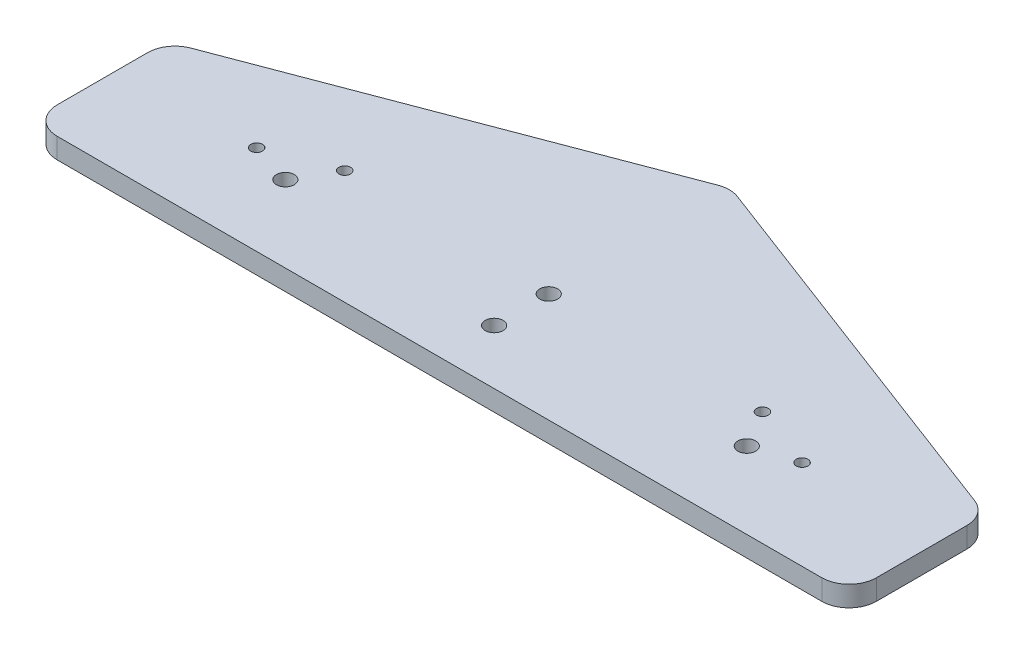
ISO-10303-21;
HEADER;
FILE_DESCRIPTION(('STEP AP214'),'2;1');
FILE_NAME('part.step','',(''),(''),'','','');
FILE_SCHEMA(('AUTOMOTIVE_DESIGN { 1 0 10303 214 1 1 1 1 }'));
ENDSEC;
DATA;
#1=APPLICATION_CONTEXT('core data for automotive mechanical design processes');
#2=APPLICATION_PROTOCOL_DEFINITION('international standard','automotive_design',2000,#1);
#3=PRODUCT_CONTEXT('',#1,'mechanical');
#4=PRODUCT('Part','Part','',(#3));
#5=PRODUCT_RELATED_PRODUCT_CATEGORY('part','',(#4));
#6=PRODUCT_DEFINITION_FORMATION('','',#4);
#7=PRODUCT_DEFINITION_CONTEXT('part definition',#1,'design');
#8=PRODUCT_DEFINITION('design','',#6,#7);
#9=PRODUCT_DEFINITION_SHAPE('','',#8);
#10=(LENGTH_UNIT() NAMED_UNIT(*) SI_UNIT(.MILLI.,.METRE.));
#11=(NAMED_UNIT(*) PLANE_ANGLE_UNIT() SI_UNIT($,.RADIAN.));
#12=(NAMED_UNIT(*) SI_UNIT($,.STERADIAN.) SOLID_ANGLE_UNIT());
#13=UNCERTAINTY_MEASURE_WITH_UNIT(LENGTH_MEASURE(1.E-05),#10,'distance_accuracy_value','');
#14=(GEOMETRIC_REPRESENTATION_CONTEXT(3) GLOBAL_UNCERTAINTY_ASSIGNED_CONTEXT((#13)) GLOBAL_UNIT_ASSIGNED_CONTEXT((#10,
#11,#12)) REPRESENTATION_CONTEXT('',''));
#15=CARTESIAN_POINT('',(0.,0.,0.));
#16=DIRECTION('',(0.,0.,1.));
#17=DIRECTION('',(1.,0.,0.));
#18=AXIS2_PLACEMENT_3D('',#15,#16,#17);
#19=CARTESIAN_POINT('',(0.,-7.5,-96.1362755383189));
#20=DIRECTION('',(0.,1.,0.));
#21=DIRECTION('',(0.,0.,1.));
#22=AXIS2_PLACEMENT_3D('',#19,#20,#21);
#23=CYLINDRICAL_SURFACE('',#22,9.99999999999999);
#24=CARTESIAN_POINT('',(0.,0.,-96.1362755383189));
#25=DIRECTION('',(0.,1.,0.));
#26=DIRECTION('',(0.,0.,1.));
#27=AXIS2_PLACEMENT_3D('',#24,#25,#26);
#28=CIRCLE('',#27,9.99999999999999);
#29=CARTESIAN_POINT('',(3.54291037997725,0.,-105.487627635179));
#30=VERTEX_POINT('',#29);
#31=CARTESIAN_POINT('',(-3.54291037997707,0.,-105.487627635179));
#32=VERTEX_POINT('',#31);
#33=EDGE_CURVE('E166',#30,#32,#28,.T.);
#34=ORIENTED_EDGE('',*,*,#33,.F.);
#35=DIRECTION('',(0.,1.,0.));
#36=VECTOR('',#35,1.);
#37=CARTESIAN_POINT('',(3.54291037997725,-7.5,-105.487627635179));
#38=LINE('',#37,#36);
#39=CARTESIAN_POINT('',(3.54291037997725,-7.5,-105.487627635179));
#40=VERTEX_POINT('',#39);
#41=EDGE_CURVE('E13',#40,#30,#38,.T.);
#42=ORIENTED_EDGE('',*,*,#41,.F.);
#43=CARTESIAN_POINT('',(0.,-7.5,-96.1362755383189));
#44=DIRECTION('',(0.,1.,0.));
#45=DIRECTION('',(0.,0.,1.));
#46=AXIS2_PLACEMENT_3D('',#43,#44,#45);
#47=CIRCLE('',#46,9.99999999999999);
#48=CARTESIAN_POINT('',(-3.54291037997707,-7.5,-105.487627635179));
#49=VERTEX_POINT('',#48);
#50=EDGE_CURVE('E203',#40,#49,#47,.T.);
#51=ORIENTED_EDGE('',*,*,#50,.T.);
#52=DIRECTION('',(0.,1.,0.));
#53=VECTOR('',#52,1.);
#54=CARTESIAN_POINT('',(-3.54291037997707,-7.5,-105.487627635179));
#55=LINE('',#54,#53);
#56=EDGE_CURVE('E54',#49,#32,#55,.T.);
#57=ORIENTED_EDGE('',*,*,#56,.T.);
#58=EDGE_LOOP('',(#34,#42,#51,#57));
#59=FACE_BOUND('',#58,.T.);
#60=ADVANCED_FACE('F51',(#59),#23,.T.);
#61=CARTESIAN_POINT('',(143.542910379977,-7.5,-52.446372417835));
#62=DIRECTION('',(0.354291037997716,0.,-0.935135209686011));
#63=DIRECTION('',(-0.935135209686012,0.,-0.354291037997717));
#64=AXIS2_PLACEMENT_3D('',#61,#62,#63);
#65=PLANE('',#64);
#66=DIRECTION('',(-0.935135209686011,0.,-0.354291037997717));
#67=VECTOR('',#66,1.);
#68=CARTESIAN_POINT('',(143.542910379977,0.,-52.446372417835));
#69=LINE('',#68,#67);
#70=CARTESIAN_POINT('',(143.542910379977,0.,-52.446372417835));
#71=VERTEX_POINT('',#70);
#72=EDGE_CURVE('E200',#71,#30,#69,.T.);
#73=ORIENTED_EDGE('',*,*,#72,.F.);
#74=DIRECTION('',(0.,1.,0.));
#75=VECTOR('',#74,1.);
#76=CARTESIAN_POINT('',(143.542910379977,-7.5,-52.446372417835));
#77=LINE('',#76,#75);
#78=CARTESIAN_POINT('',(143.542910379977,-7.5,-52.446372417835));
#79=VERTEX_POINT('',#78);
#80=EDGE_CURVE('E61',#79,#71,#77,.T.);
#81=ORIENTED_EDGE('',*,*,#80,.F.);
#82=DIRECTION('',(-0.935135209686011,0.,-0.354291037997717));
#83=VECTOR('',#82,1.);
#84=CARTESIAN_POINT('',(143.542910379977,-7.5,-52.446372417835));
#85=LINE('',#84,#83);
#86=EDGE_CURVE('E152',#79,#40,#85,.T.);
#87=ORIENTED_EDGE('',*,*,#86,.T.);
#88=ORIENTED_EDGE('',*,*,#41,.T.);
#89=EDGE_LOOP('',(#73,#81,#87,#88));
#90=FACE_BOUND('',#89,.T.);
#91=ADVANCED_FACE('F228',(#90),#65,.T.);
#92=CARTESIAN_POINT('',(140.,-7.5,-43.0950203209749));
#93=DIRECTION('',(0.,1.,0.));
#94=DIRECTION('',(0.,0.,1.));
#95=AXIS2_PLACEMENT_3D('',#92,#93,#94);
#96=CYLINDRICAL_SURFACE('',#95,10.);
#97=CARTESIAN_POINT('',(140.,0.,-43.0950203209749));
#98=DIRECTION('',(0.,1.,0.));
#99=DIRECTION('',(0.,0.,1.));
#100=AXIS2_PLACEMENT_3D('',#97,#98,#99);
#101=CIRCLE('',#100,10.);
#102=CARTESIAN_POINT('',(150.,0.,-43.0950203209749));
#103=VERTEX_POINT('',#102);
#104=EDGE_CURVE('E138',#103,#71,#101,.T.);
#105=ORIENTED_EDGE('',*,*,#104,.F.);
#106=DIRECTION('',(0.,1.,0.));
#107=VECTOR('',#106,1.);
#108=CARTESIAN_POINT('',(150.,-7.5,-43.0950203209749));
#109=LINE('',#108,#107);
#110=CARTESIAN_POINT('',(150.,-7.5,-43.0950203209749));
#111=VERTEX_POINT('',#110);
#112=EDGE_CURVE('E133',#111,#103,#109,.T.);
#113=ORIENTED_EDGE('',*,*,#112,.F.);
#114=CARTESIAN_POINT('',(140.,-7.5,-43.0950203209749));
#115=DIRECTION('',(0.,1.,0.));
#116=DIRECTION('',(0.,0.,1.));
#117=AXIS2_PLACEMENT_3D('',#114,#115,#116);
#118=CIRCLE('',#117,10.);
#119=EDGE_CURVE('E136',#111,#79,#118,.T.);
#120=ORIENTED_EDGE('',*,*,#119,.T.);
#121=ORIENTED_EDGE('',*,*,#80,.T.);
#122=EDGE_LOOP('',(#105,#113,#120,#121));
#123=FACE_BOUND('',#122,.T.);
#124=ADVANCED_FACE('F135',(#123),#96,.T.);
#125=CARTESIAN_POINT('',(150.,-7.5,-10.));
#126=DIRECTION('',(1.,0.,0.));
#127=DIRECTION('',(0.,0.,-1.));
#128=AXIS2_PLACEMENT_3D('',#125,#126,#127);
#129=PLANE('',#128);
#130=DIRECTION('',(0.,0.,-1.));
#131=VECTOR('',#130,1.);
#132=CARTESIAN_POINT('',(150.,0.,-10.));
#133=LINE('',#132,#131);
#134=CARTESIAN_POINT('',(150.,0.,-10.));
#135=VERTEX_POINT('',#134);
#136=EDGE_CURVE('E195',#135,#103,#133,.T.);
#137=ORIENTED_EDGE('',*,*,#136,.F.);
#138=DIRECTION('',(0.,1.,0.));
#139=VECTOR('',#138,1.);
#140=CARTESIAN_POINT('',(150.,-7.5,-10.));
#141=LINE('',#140,#139);
#142=CARTESIAN_POINT('',(150.,-7.5,-10.));
#143=VERTEX_POINT('',#142);
#144=EDGE_CURVE('E144',#143,#135,#141,.T.);
#145=ORIENTED_EDGE('',*,*,#144,.F.);
#146=DIRECTION('',(0.,0.,-1.));
#147=VECTOR('',#146,1.);
#148=CARTESIAN_POINT('',(150.,-7.5,-10.));
#149=LINE('',#148,#147);
#150=EDGE_CURVE('E150',#143,#111,#149,.T.);
#151=ORIENTED_EDGE('',*,*,#150,.T.);
#152=ORIENTED_EDGE('',*,*,#112,.T.);
#153=EDGE_LOOP('',(#137,#145,#151,#152));
#154=FACE_BOUND('',#153,.T.);
#155=ADVANCED_FACE('F155',(#154),#129,.T.);
#156=CARTESIAN_POINT('',(140.,-7.5,-10.));
#157=DIRECTION('',(0.,1.,0.));
#158=DIRECTION('',(0.,0.,1.));
#159=AXIS2_PLACEMENT_3D('',#156,#157,#158);
#160=CYLINDRICAL_SURFACE('',#159,10.);
#161=CARTESIAN_POINT('',(140.,0.,-10.));
#162=DIRECTION('',(0.,1.,0.));
#163=DIRECTION('',(0.,0.,1.));
#164=AXIS2_PLACEMENT_3D('',#161,#162,#163);
#165=CIRCLE('',#164,10.);
#166=CARTESIAN_POINT('',(140.,0.,0.));
#167=VERTEX_POINT('',#166);
#168=EDGE_CURVE('E191',#167,#135,#165,.T.);
#169=ORIENTED_EDGE('',*,*,#168,.F.);
#170=DIRECTION('',(0.,1.,0.));
#171=VECTOR('',#170,1.);
#172=CARTESIAN_POINT('',(140.,-7.5,0.));
#173=LINE('',#172,#171);
#174=CARTESIAN_POINT('',(140.,-7.5,0.));
#175=VERTEX_POINT('',#174);
#176=EDGE_CURVE('E209',#175,#167,#173,.T.);
#177=ORIENTED_EDGE('',*,*,#176,.F.);
#178=CARTESIAN_POINT('',(140.,-7.5,-10.));
#179=DIRECTION('',(0.,1.,0.));
#180=DIRECTION('',(0.,0.,1.));
#181=AXIS2_PLACEMENT_3D('',#178,#179,#180);
#182=CIRCLE('',#181,10.);
#183=EDGE_CURVE('E157',#175,#143,#182,.T.);
#184=ORIENTED_EDGE('',*,*,#183,.T.);
#185=ORIENTED_EDGE('',*,*,#144,.T.);
#186=EDGE_LOOP('',(#169,#177,#184,#185));
#187=FACE_BOUND('',#186,.T.);
#188=ADVANCED_FACE('F241',(#187),#160,.T.);
#189=CARTESIAN_POINT('',(0.,-7.5,0.));
#190=DIRECTION('',(0.,0.,1.));
#191=DIRECTION('',(1.,0.,0.));
#192=AXIS2_PLACEMENT_3D('',#189,#190,#191);
#193=PLANE('',#192);
#194=DIRECTION('',(1.,0.,0.));
#195=VECTOR('',#194,1.);
#196=CARTESIAN_POINT('',(0.,0.,0.));
#197=LINE('',#196,#195);
#198=CARTESIAN_POINT('',(-140.,0.,0.));
#199=VERTEX_POINT('',#198);
#200=EDGE_CURVE('E187',#199,#167,#197,.T.);
#201=ORIENTED_EDGE('',*,*,#200,.F.);
#202=DIRECTION('',(0.,1.,0.));
#203=VECTOR('',#202,1.);
#204=CARTESIAN_POINT('',(-140.,-7.5,0.));
#205=LINE('',#204,#203);
#206=CARTESIAN_POINT('',(-140.,-7.5,0.));
#207=VERTEX_POINT('',#206);
#208=EDGE_CURVE('E212',#207,#199,#205,.T.);
#209=ORIENTED_EDGE('',*,*,#208,.F.);
#210=DIRECTION('',(1.,0.,0.));
#211=VECTOR('',#210,1.);
#212=CARTESIAN_POINT('',(-140.,-7.5,0.));
#213=LINE('',#212,#211);
#214=EDGE_CURVE('E160',#207,#175,#213,.T.);
#215=ORIENTED_EDGE('',*,*,#214,.T.);
#216=ORIENTED_EDGE('',*,*,#176,.T.);
#217=EDGE_LOOP('',(#201,#209,#215,#216));
#218=FACE_BOUND('',#217,.T.);
#219=ADVANCED_FACE('F244',(#218),#193,.T.);
#220=CARTESIAN_POINT('',(-140.,-7.5,-10.));
#221=DIRECTION('',(0.,1.,0.));
#222=DIRECTION('',(0.,0.,1.));
#223=AXIS2_PLACEMENT_3D('',#220,#221,#222);
#224=CYLINDRICAL_SURFACE('',#223,10.);
#225=CARTESIAN_POINT('',(-140.,0.,-10.));
#226=DIRECTION('',(0.,1.,0.));
#227=DIRECTION('',(0.,0.,1.));
#228=AXIS2_PLACEMENT_3D('',#225,#226,#227);
#229=CIRCLE('',#228,10.);
#230=CARTESIAN_POINT('',(-150.,0.,-10.));
#231=VERTEX_POINT('',#230);
#232=EDGE_CURVE('E183',#231,#199,#229,.T.);
#233=ORIENTED_EDGE('',*,*,#232,.F.);
#234=DIRECTION('',(0.,1.,0.));
#235=VECTOR('',#234,1.);
#236=CARTESIAN_POINT('',(-150.,-7.5,-10.));
#237=LINE('',#236,#235);
#238=CARTESIAN_POINT('',(-150.,-7.5,-10.));
#239=VERTEX_POINT('',#238);
#240=EDGE_CURVE('E216',#239,#231,#237,.T.);
#241=ORIENTED_EDGE('',*,*,#240,.F.);
#242=CARTESIAN_POINT('',(-140.,-7.5,-10.));
#243=DIRECTION('',(0.,1.,0.));
#244=DIRECTION('',(0.,0.,1.));
#245=AXIS2_PLACEMENT_3D('',#242,#243,#244);
#246=CIRCLE('',#245,10.);
#247=EDGE_CURVE('E384',#239,#207,#246,.T.);
#248=ORIENTED_EDGE('',*,*,#247,.T.);
#249=ORIENTED_EDGE('',*,*,#208,.T.);
#250=EDGE_LOOP('',(#233,#241,#248,#249));
#251=FACE_BOUND('',#250,.T.);
#252=ADVANCED_FACE('F248',(#251),#224,.T.);
#253=CARTESIAN_POINT('',(-150.,-7.5,-43.0950203209749));
#254=DIRECTION('',(-1.,0.,0.));
#255=DIRECTION('',(0.,0.,1.));
#256=AXIS2_PLACEMENT_3D('',#253,#254,#255);
#257=PLANE('',#256);
#258=DIRECTION('',(0.,0.,1.));
#259=VECTOR('',#258,1.);
#260=CARTESIAN_POINT('',(-150.,0.,-43.0950203209749));
#261=LINE('',#260,#259);
#262=CARTESIAN_POINT('',(-150.,0.,-43.0950203209749));
#263=VERTEX_POINT('',#262);
#264=EDGE_CURVE('E179',#263,#231,#261,.T.);
#265=ORIENTED_EDGE('',*,*,#264,.F.);
#266=DIRECTION('',(0.,1.,0.));
#267=VECTOR('',#266,1.);
#268=CARTESIAN_POINT('',(-150.,-7.5,-43.0950203209749));
#269=LINE('',#268,#267);
#270=CARTESIAN_POINT('',(-150.,-7.5,-43.0950203209749));
#271=VERTEX_POINT('',#270);
#272=EDGE_CURVE('E219',#271,#263,#269,.T.);
#273=ORIENTED_EDGE('',*,*,#272,.F.);
#274=DIRECTION('',(0.,0.,1.));
#275=VECTOR('',#274,1.);
#276=CARTESIAN_POINT('',(-150.,-7.5,-43.0950203209749));
#277=LINE('',#276,#275);
#278=EDGE_CURVE('E380',#271,#239,#277,.T.);
#279=ORIENTED_EDGE('',*,*,#278,.T.);
#280=ORIENTED_EDGE('',*,*,#240,.T.);
#281=EDGE_LOOP('',(#265,#273,#279,#280));
#282=FACE_BOUND('',#281,.T.);
#283=ADVANCED_FACE('F252',(#282),#257,.T.);
#284=CARTESIAN_POINT('',(-140.,-7.5,-43.0950203209749));
#285=DIRECTION('',(0.,1.,0.));
#286=DIRECTION('',(0.,0.,1.));
#287=AXIS2_PLACEMENT_3D('',#284,#285,#286);
#288=CYLINDRICAL_SURFACE('',#287,9.99999999999999);
#289=CARTESIAN_POINT('',(-140.,0.,-43.0950203209749));
#290=DIRECTION('',(0.,1.,0.));
#291=DIRECTION('',(0.,0.,1.));
#292=AXIS2_PLACEMENT_3D('',#289,#290,#291);
#293=CIRCLE('',#292,9.99999999999999);
#294=CARTESIAN_POINT('',(-143.542910379977,0.,-52.446372417835));
#295=VERTEX_POINT('',#294);
#296=EDGE_CURVE('E175',#295,#263,#293,.T.);
#297=ORIENTED_EDGE('',*,*,#296,.F.);
#298=DIRECTION('',(0.,1.,0.));
#299=VECTOR('',#298,1.);
#300=CARTESIAN_POINT('',(-143.542910379977,-7.5,-52.446372417835));
#301=LINE('',#300,#299);
#302=CARTESIAN_POINT('',(-143.542910379977,-7.5,-52.446372417835));
#303=VERTEX_POINT('',#302);
#304=EDGE_CURVE('E221',#303,#295,#301,.T.);
#305=ORIENTED_EDGE('',*,*,#304,.F.);
#306=CARTESIAN_POINT('',(-140.,-7.5,-43.0950203209749));
#307=DIRECTION('',(0.,1.,0.));
#308=DIRECTION('',(0.,0.,1.));
#309=AXIS2_PLACEMENT_3D('',#306,#307,#308);
#310=CIRCLE('',#309,9.99999999999999);
#311=EDGE_CURVE('E376',#303,#271,#310,.T.);
#312=ORIENTED_EDGE('',*,*,#311,.T.);
#313=ORIENTED_EDGE('',*,*,#272,.T.);
#314=EDGE_LOOP('',(#297,#305,#312,#313));
#315=FACE_BOUND('',#314,.T.);
#316=ADVANCED_FACE('F256',(#315),#288,.T.);
#317=CARTESIAN_POINT('',(-3.54291037997707,-7.5,-105.487627635179));
#318=DIRECTION('',(-0.354291037997716,0.,-0.935135209686012));
#319=DIRECTION('',(-0.935135209686012,0.,0.354291037997716));
#320=AXIS2_PLACEMENT_3D('',#317,#318,#319);
#321=PLANE('',#320);
#322=DIRECTION('',(-0.935135209686011,0.,0.354291037997716));
#323=VECTOR('',#322,1.);
#324=CARTESIAN_POINT('',(-3.54291037997707,0.,-105.487627635179));
#325=LINE('',#324,#323);
#326=EDGE_CURVE('E170',#32,#295,#325,.T.);
#327=ORIENTED_EDGE('',*,*,#326,.F.);
#328=ORIENTED_EDGE('',*,*,#56,.F.);
#329=DIRECTION('',(-0.935135209686011,0.,0.354291037997716));
#330=VECTOR('',#329,1.);
#331=CARTESIAN_POINT('',(-3.54291037997707,-7.5,-105.487627635179));
#332=LINE('',#331,#330);
#333=EDGE_CURVE('E373',#49,#303,#332,.T.);
#334=ORIENTED_EDGE('',*,*,#333,.T.);
#335=ORIENTED_EDGE('',*,*,#304,.T.);
#336=EDGE_LOOP('',(#327,#328,#334,#335));
#337=FACE_BOUND('',#336,.T.);
#338=ADVANCED_FACE('F225',(#337),#321,.T.);
#339=CARTESIAN_POINT('',(0.,-7.5,-96.1362755383189));
#340=DIRECTION('',(0.,1.,0.));
#341=DIRECTION('',(0.,0.,1.));
#342=AXIS2_PLACEMENT_3D('',#339,#340,#341);
#343=PLANE('',#342);
#344=CARTESIAN_POINT('',(-76.4911969401864,-7.5,-41.7589565849451));
#345=DIRECTION('',(0.,1.,0.));
#346=DIRECTION('',(0.,0.,1.));
#347=AXIS2_PLACEMENT_3D('',#344,#345,#346);
#348=CIRCLE('',#347,2.15);
#349=CARTESIAN_POINT('',(-76.4911969401864,-7.5,-39.6089565849451));
#350=VERTEX_POINT('',#349);
#351=EDGE_CURVE('E307',#350,#350,#348,.T.);
#352=ORIENTED_EDGE('',*,*,#351,.T.);
#353=EDGE_LOOP('',(#352));
#354=FACE_BOUND('',#353,.T.);
#355=CARTESIAN_POINT('',(-99.8695771746148,-7.5,-32.9016806379277));
#356=DIRECTION('',(0.,1.,0.));
#357=DIRECTION('',(0.,0.,1.));
#358=AXIS2_PLACEMENT_3D('',#355,#356,#357);
#359=CIRCLE('',#358,2.15);
#360=CARTESIAN_POINT('',(-99.8695771746148,-7.5,-30.7516806379277));
#361=VERTEX_POINT('',#360);
#362=EDGE_CURVE('E320',#361,#361,#359,.T.);
#363=ORIENTED_EDGE('',*,*,#362,.T.);
#364=EDGE_LOOP('',(#363));
#365=FACE_BOUND('',#364,.T.);
#366=CARTESIAN_POINT('',(76.4911969401864,-7.5,-41.7589565849451));
#367=DIRECTION('',(0.,1.,0.));
#368=DIRECTION('',(0.,0.,1.));
#369=AXIS2_PLACEMENT_3D('',#366,#367,#368);
#370=CIRCLE('',#369,2.15);
#371=CARTESIAN_POINT('',(76.4911969401864,-7.5,-39.6089565849451));
#372=VERTEX_POINT('',#371);
#373=EDGE_CURVE('E328',#372,#372,#370,.T.);
#374=ORIENTED_EDGE('',*,*,#373,.T.);
#375=EDGE_LOOP('',(#374));
#376=FACE_BOUND('',#375,.T.);
#377=CARTESIAN_POINT('',(99.8695771746148,-7.5,-32.9016806379277));
#378=DIRECTION('',(0.,1.,0.));
#379=DIRECTION('',(0.,0.,1.));
#380=AXIS2_PLACEMENT_3D('',#377,#378,#379);
#381=CIRCLE('',#380,2.15);
#382=CARTESIAN_POINT('',(99.8695771746148,-7.5,-30.7516806379277));
#383=VERTEX_POINT('',#382);
#384=EDGE_CURVE('E336',#383,#383,#381,.T.);
#385=ORIENTED_EDGE('',*,*,#384,.T.);
#386=EDGE_LOOP('',(#385));
#387=FACE_BOUND('',#386,.T.);
#388=CARTESIAN_POINT('',(84.4997670876,-7.50000000000001,-28.0311400110027));
#389=DIRECTION('',(0.,1.,0.));
#390=DIRECTION('',(0.,0.,1.));
#391=AXIS2_PLACEMENT_3D('',#388,#389,#390);
#392=CIRCLE('',#391,3.26389999999999);
#393=CARTESIAN_POINT('',(84.4997670876,-7.50000000000001,-24.7672400110027));
#394=VERTEX_POINT('',#393);
#395=EDGE_CURVE('E344',#394,#394,#392,.T.);
#396=ORIENTED_EDGE('',*,*,#395,.T.);
#397=EDGE_LOOP('',(#396));
#398=FACE_BOUND('',#397,.T.);
#399=CARTESIAN_POINT('',(-84.4997670876001,-7.50000000000001,-28.0311400110026));
#400=DIRECTION('',(0.,1.,0.));
#401=DIRECTION('',(0.,0.,1.));
#402=AXIS2_PLACEMENT_3D('',#399,#400,#401);
#403=CIRCLE('',#402,3.26389999999999);
#404=CARTESIAN_POINT('',(-84.4997670876001,-7.50000000000001,-24.7672400110027));
#405=VERTEX_POINT('',#404);
#406=EDGE_CURVE('E352',#405,#405,#403,.T.);
#407=ORIENTED_EDGE('',*,*,#406,.T.);
#408=EDGE_LOOP('',(#407));
#409=FACE_BOUND('',#408,.T.);
#410=CARTESIAN_POINT('',(0.,-7.50000000000001,-40.));
#411=DIRECTION('',(0.,1.,0.));
#412=DIRECTION('',(0.,0.,1.));
#413=AXIS2_PLACEMENT_3D('',#410,#411,#412);
#414=CIRCLE('',#413,3.26389999999999);
#415=CARTESIAN_POINT('',(0.,-7.50000000000001,-36.7361));
#416=VERTEX_POINT('',#415);
#417=EDGE_CURVE('E360',#416,#416,#414,.T.);
#418=ORIENTED_EDGE('',*,*,#417,.T.);
#419=EDGE_LOOP('',(#418));
#420=FACE_BOUND('',#419,.T.);
#421=CARTESIAN_POINT('',(0.,-7.50000000000001,-20.));
#422=DIRECTION('',(0.,1.,0.));
#423=DIRECTION('',(0.,0.,1.));
#424=AXIS2_PLACEMENT_3D('',#421,#422,#423);
#425=CIRCLE('',#424,3.26389999999999);
#426=CARTESIAN_POINT('',(0.,-7.50000000000001,-16.7361));
#427=VERTEX_POINT('',#426);
#428=EDGE_CURVE('E171',#427,#427,#425,.T.);
#429=ORIENTED_EDGE('',*,*,#428,.T.);
#430=EDGE_LOOP('',(#429));
#431=FACE_BOUND('',#430,.T.);
#432=ORIENTED_EDGE('',*,*,#50,.F.);
#433=ORIENTED_EDGE('',*,*,#86,.F.);
#434=ORIENTED_EDGE('',*,*,#119,.F.);
#435=ORIENTED_EDGE('',*,*,#150,.F.);
#436=ORIENTED_EDGE('',*,*,#183,.F.);
#437=ORIENTED_EDGE('',*,*,#214,.F.);
#438=ORIENTED_EDGE('',*,*,#247,.F.);
#439=ORIENTED_EDGE('',*,*,#278,.F.);
#440=ORIENTED_EDGE('',*,*,#311,.F.);
#441=ORIENTED_EDGE('',*,*,#333,.F.);
#442=EDGE_LOOP('',(#432,#433,#434,#435,#436,#437,#438,#439,#440,#441));
#443=FACE_BOUND('',#442,.T.);
#444=ADVANCED_FACE('F148',(#354,#365,#376,#387,#398,#409,#420,#431,#443),#343,.F.);
#445=CARTESIAN_POINT('',(0.,0.,-96.1362755383189));
#446=DIRECTION('',(0.,1.,0.));
#447=DIRECTION('',(0.,0.,1.));
#448=AXIS2_PLACEMENT_3D('',#445,#446,#447);
#449=PLANE('',#448);
#450=CARTESIAN_POINT('',(-76.4911969401864,0.,-41.7589565849451));
#451=DIRECTION('',(0.,1.,0.));
#452=DIRECTION('',(0.,0.,1.));
#453=AXIS2_PLACEMENT_3D('',#450,#451,#452);
#454=CIRCLE('',#453,2.15);
#455=CARTESIAN_POINT('',(-76.4911969401864,0.,-39.6089565849451));
#456=VERTEX_POINT('',#455);
#457=EDGE_CURVE('E310',#456,#456,#454,.T.);
#458=ORIENTED_EDGE('',*,*,#457,.F.);
#459=EDGE_LOOP('',(#458));
#460=FACE_BOUND('',#459,.T.);
#461=CARTESIAN_POINT('',(-99.8695771746148,0.,-32.9016806379277));
#462=DIRECTION('',(0.,1.,0.));
#463=DIRECTION('',(0.,0.,1.));
#464=AXIS2_PLACEMENT_3D('',#461,#462,#463);
#465=CIRCLE('',#464,2.15);
#466=CARTESIAN_POINT('',(-99.8695771746148,0.,-30.7516806379277));
#467=VERTEX_POINT('',#466);
#468=EDGE_CURVE('E314',#467,#467,#465,.T.);
#469=ORIENTED_EDGE('',*,*,#468,.F.);
#470=EDGE_LOOP('',(#469));
#471=FACE_BOUND('',#470,.T.);
#472=CARTESIAN_POINT('',(76.4911969401864,0.,-41.7589565849451));
#473=DIRECTION('',(0.,1.,0.));
#474=DIRECTION('',(0.,0.,1.));
#475=AXIS2_PLACEMENT_3D('',#472,#473,#474);
#476=CIRCLE('',#475,2.15);
#477=CARTESIAN_POINT('',(76.4911969401864,0.,-39.6089565849451));
#478=VERTEX_POINT('',#477);
#479=EDGE_CURVE('E324',#478,#478,#476,.T.);
#480=ORIENTED_EDGE('',*,*,#479,.F.);
#481=EDGE_LOOP('',(#480));
#482=FACE_BOUND('',#481,.T.);
#483=CARTESIAN_POINT('',(99.8695771746148,0.,-32.9016806379277));
#484=DIRECTION('',(0.,1.,0.));
#485=DIRECTION('',(0.,0.,1.));
#486=AXIS2_PLACEMENT_3D('',#483,#484,#485);
#487=CIRCLE('',#486,2.15);
#488=CARTESIAN_POINT('',(99.8695771746148,0.,-30.7516806379277));
#489=VERTEX_POINT('',#488);
#490=EDGE_CURVE('E332',#489,#489,#487,.T.);
#491=ORIENTED_EDGE('',*,*,#490,.F.);
#492=EDGE_LOOP('',(#491));
#493=FACE_BOUND('',#492,.T.);
#494=CARTESIAN_POINT('',(84.4997670876,0.,-28.0311400110027));
#495=DIRECTION('',(0.,1.,0.));
#496=DIRECTION('',(0.,0.,1.));
#497=AXIS2_PLACEMENT_3D('',#494,#495,#496);
#498=CIRCLE('',#497,3.26389999999999);
#499=CARTESIAN_POINT('',(84.4997670876,0.,-24.7672400110027));
#500=VERTEX_POINT('',#499);
#501=EDGE_CURVE('E340',#500,#500,#498,.T.);
#502=ORIENTED_EDGE('',*,*,#501,.F.);
#503=EDGE_LOOP('',(#502));
#504=FACE_BOUND('',#503,.T.);
#505=CARTESIAN_POINT('',(-84.4997670876001,0.,-28.0311400110026));
#506=DIRECTION('',(0.,1.,0.));
#507=DIRECTION('',(0.,0.,1.));
#508=AXIS2_PLACEMENT_3D('',#505,#506,#507);
#509=CIRCLE('',#508,3.26389999999999);
#510=CARTESIAN_POINT('',(-84.4997670876001,0.,-24.7672400110027));
#511=VERTEX_POINT('',#510);
#512=EDGE_CURVE('E348',#511,#511,#509,.T.);
#513=ORIENTED_EDGE('',*,*,#512,.F.);
#514=EDGE_LOOP('',(#513));
#515=FACE_BOUND('',#514,.T.);
#516=CARTESIAN_POINT('',(0.,0.,-40.));
#517=DIRECTION('',(0.,1.,0.));
#518=DIRECTION('',(0.,0.,1.));
#519=AXIS2_PLACEMENT_3D('',#516,#517,#518);
#520=CIRCLE('',#519,3.26389999999999);
#521=CARTESIAN_POINT('',(0.,0.,-36.7361));
#522=VERTEX_POINT('',#521);
#523=EDGE_CURVE('E356',#522,#522,#520,.T.);
#524=ORIENTED_EDGE('',*,*,#523,.F.);
#525=EDGE_LOOP('',(#524));
#526=FACE_BOUND('',#525,.T.);
#527=CARTESIAN_POINT('',(0.,0.,-20.));
#528=DIRECTION('',(0.,1.,0.));
#529=DIRECTION('',(0.,0.,1.));
#530=AXIS2_PLACEMENT_3D('',#527,#528,#529);
#531=CIRCLE('',#530,3.26389999999999);
#532=CARTESIAN_POINT('',(0.,0.,-16.7361));
#533=VERTEX_POINT('',#532);
#534=EDGE_CURVE('E364',#533,#533,#531,.T.);
#535=ORIENTED_EDGE('',*,*,#534,.F.);
#536=EDGE_LOOP('',(#535));
#537=FACE_BOUND('',#536,.T.);
#538=ORIENTED_EDGE('',*,*,#33,.T.);
#539=ORIENTED_EDGE('',*,*,#326,.T.);
#540=ORIENTED_EDGE('',*,*,#296,.T.);
#541=ORIENTED_EDGE('',*,*,#264,.T.);
#542=ORIENTED_EDGE('',*,*,#232,.T.);
#543=ORIENTED_EDGE('',*,*,#200,.T.);
#544=ORIENTED_EDGE('',*,*,#168,.T.);
#545=ORIENTED_EDGE('',*,*,#136,.T.);
#546=ORIENTED_EDGE('',*,*,#104,.T.);
#547=ORIENTED_EDGE('',*,*,#72,.T.);
#548=EDGE_LOOP('',(#538,#539,#540,#541,#542,#543,#544,#545,#546,#547));
#549=FACE_BOUND('',#548,.T.);
#550=ADVANCED_FACE('F227',(#460,#471,#482,#493,#504,#515,#526,#537,#549),#449,.T.);
#551=CARTESIAN_POINT('',(0.,0.,-20.));
#552=DIRECTION('',(0.,1.,0.));
#553=DIRECTION('',(0.,0.,1.));
#554=AXIS2_PLACEMENT_3D('',#551,#552,#553);
#555=CYLINDRICAL_SURFACE('',#554,3.26389999999999);
#556=ORIENTED_EDGE('',*,*,#428,.F.);
#557=EDGE_LOOP('',(#556));
#558=FACE_BOUND('',#557,.T.);
#559=ORIENTED_EDGE('',*,*,#534,.T.);
#560=EDGE_LOOP('',(#559));
#561=FACE_BOUND('',#560,.T.);
#562=ADVANCED_FACE('F268',(#558,#561),#555,.F.);
#563=CARTESIAN_POINT('',(0.,0.,-40.));
#564=DIRECTION('',(0.,1.,0.));
#565=DIRECTION('',(0.,0.,1.));
#566=AXIS2_PLACEMENT_3D('',#563,#564,#565);
#567=CYLINDRICAL_SURFACE('',#566,3.26389999999999);
#568=ORIENTED_EDGE('',*,*,#417,.F.);
#569=EDGE_LOOP('',(#568));
#570=FACE_BOUND('',#569,.T.);
#571=ORIENTED_EDGE('',*,*,#523,.T.);
#572=EDGE_LOOP('',(#571));
#573=FACE_BOUND('',#572,.T.);
#574=ADVANCED_FACE('F275',(#570,#573),#567,.F.);
#575=CARTESIAN_POINT('',(-84.4997670876001,0.,-28.0311400110026));
#576=DIRECTION('',(0.,1.,0.));
#577=DIRECTION('',(0.,0.,1.));
#578=AXIS2_PLACEMENT_3D('',#575,#576,#577);
#579=CYLINDRICAL_SURFACE('',#578,3.26389999999999);
#580=ORIENTED_EDGE('',*,*,#406,.F.);
#581=EDGE_LOOP('',(#580));
#582=FACE_BOUND('',#581,.T.);
#583=ORIENTED_EDGE('',*,*,#512,.T.);
#584=EDGE_LOOP('',(#583));
#585=FACE_BOUND('',#584,.T.);
#586=ADVANCED_FACE('F279',(#582,#585),#579,.F.);
#587=CARTESIAN_POINT('',(84.4997670876,0.,-28.0311400110027));
#588=DIRECTION('',(0.,1.,0.));
#589=DIRECTION('',(0.,0.,1.));
#590=AXIS2_PLACEMENT_3D('',#587,#588,#589);
#591=CYLINDRICAL_SURFACE('',#590,3.26389999999999);
#592=ORIENTED_EDGE('',*,*,#395,.F.);
#593=EDGE_LOOP('',(#592));
#594=FACE_BOUND('',#593,.T.);
#595=ORIENTED_EDGE('',*,*,#501,.T.);
#596=EDGE_LOOP('',(#595));
#597=FACE_BOUND('',#596,.T.);
#598=ADVANCED_FACE('F283',(#594,#597),#591,.F.);
#599=CARTESIAN_POINT('',(99.8695771746148,0.,-32.9016806379277));
#600=DIRECTION('',(0.,1.,0.));
#601=DIRECTION('',(0.,0.,1.));
#602=AXIS2_PLACEMENT_3D('',#599,#600,#601);
#603=CYLINDRICAL_SURFACE('',#602,2.15);
#604=ORIENTED_EDGE('',*,*,#384,.F.);
#605=EDGE_LOOP('',(#604));
#606=FACE_BOUND('',#605,.T.);
#607=ORIENTED_EDGE('',*,*,#490,.T.);
#608=EDGE_LOOP('',(#607));
#609=FACE_BOUND('',#608,.T.);
#610=ADVANCED_FACE('F287',(#606,#609),#603,.F.);
#611=CARTESIAN_POINT('',(76.4911969401864,0.,-41.7589565849451));
#612=DIRECTION('',(0.,1.,0.));
#613=DIRECTION('',(0.,0.,1.));
#614=AXIS2_PLACEMENT_3D('',#611,#612,#613);
#615=CYLINDRICAL_SURFACE('',#614,2.15);
#616=ORIENTED_EDGE('',*,*,#373,.F.);
#617=EDGE_LOOP('',(#616));
#618=FACE_BOUND('',#617,.T.);
#619=ORIENTED_EDGE('',*,*,#479,.T.);
#620=EDGE_LOOP('',(#619));
#621=FACE_BOUND('',#620,.T.);
#622=ADVANCED_FACE('F291',(#618,#621),#615,.F.);
#623=CARTESIAN_POINT('',(-99.8695771746148,0.,-32.9016806379277));
#624=DIRECTION('',(0.,1.,0.));
#625=DIRECTION('',(0.,0.,1.));
#626=AXIS2_PLACEMENT_3D('',#623,#624,#625);
#627=CYLINDRICAL_SURFACE('',#626,2.15);
#628=ORIENTED_EDGE('',*,*,#362,.F.);
#629=EDGE_LOOP('',(#628));
#630=FACE_BOUND('',#629,.T.);
#631=ORIENTED_EDGE('',*,*,#468,.T.);
#632=EDGE_LOOP('',(#631));
#633=FACE_BOUND('',#632,.T.);
#634=ADVANCED_FACE('F295',(#630,#633),#627,.F.);
#635=CARTESIAN_POINT('',(-76.4911969401864,0.,-41.7589565849451));
#636=DIRECTION('',(0.,1.,0.));
#637=DIRECTION('',(0.,0.,1.));
#638=AXIS2_PLACEMENT_3D('',#635,#636,#637);
#639=CYLINDRICAL_SURFACE('',#638,2.15);
#640=ORIENTED_EDGE('',*,*,#351,.F.);
#641=EDGE_LOOP('',(#640));
#642=FACE_BOUND('',#641,.T.);
#643=ORIENTED_EDGE('',*,*,#457,.T.);
#644=EDGE_LOOP('',(#643));
#645=FACE_BOUND('',#644,.T.);
#646=ADVANCED_FACE('F299',(#642,#645),#639,.F.);
#647=CLOSED_SHELL('',(#60,#91,#124,#155,#188,#219,#252,#283,#316,#338,#444,#550,#562,#574,#586,
#598,#610,#622,#634,#646));
#648=MANIFOLD_SOLID_BREP('B2',#647);
#649=ADVANCED_BREP_SHAPE_REPRESENTATION('',(#18,#648),#14);
#650=SHAPE_DEFINITION_REPRESENTATION(#9,#649);
ENDSEC;
END-ISO-10303-21;
